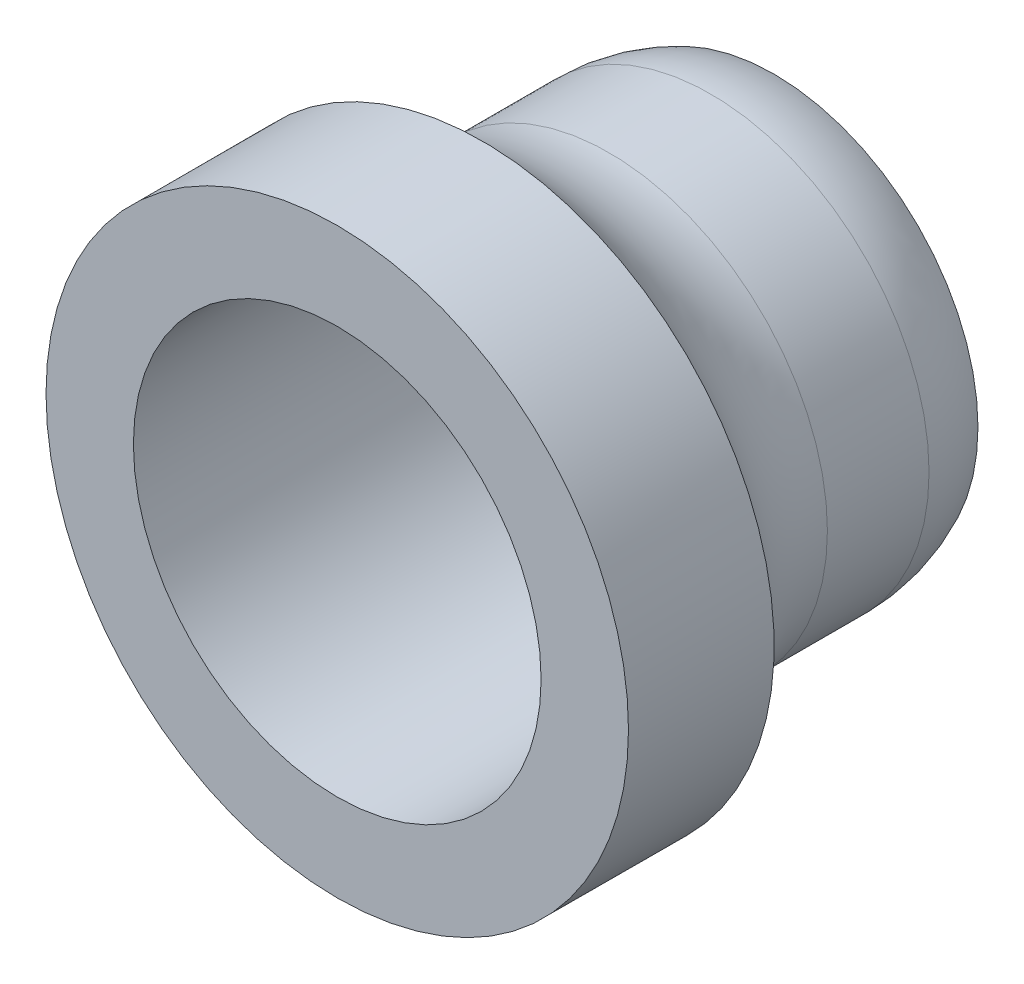
ISO-10303-21;
HEADER;
FILE_DESCRIPTION(('STEP AP214'),'2;1');
FILE_NAME('part.step','',(''),(''),'','','');
FILE_SCHEMA(('AUTOMOTIVE_DESIGN { 1 0 10303 214 1 1 1 1 }'));
ENDSEC;
DATA;
#1=APPLICATION_CONTEXT('core data for automotive mechanical design processes');
#2=APPLICATION_PROTOCOL_DEFINITION('international standard','automotive_design',2000,#1);
#3=PRODUCT_CONTEXT('',#1,'mechanical');
#4=PRODUCT('Part','Part','',(#3));
#5=PRODUCT_RELATED_PRODUCT_CATEGORY('part','',(#4));
#6=PRODUCT_DEFINITION_FORMATION('','',#4);
#7=PRODUCT_DEFINITION_CONTEXT('part definition',#1,'design');
#8=PRODUCT_DEFINITION('design','',#6,#7);
#9=PRODUCT_DEFINITION_SHAPE('','',#8);
#10=(LENGTH_UNIT() NAMED_UNIT(*) SI_UNIT(.MILLI.,.METRE.));
#11=(NAMED_UNIT(*) PLANE_ANGLE_UNIT() SI_UNIT($,.RADIAN.));
#12=(NAMED_UNIT(*) SI_UNIT($,.STERADIAN.) SOLID_ANGLE_UNIT());
#13=UNCERTAINTY_MEASURE_WITH_UNIT(LENGTH_MEASURE(1.E-05),#10,'distance_accuracy_value','');
#14=(GEOMETRIC_REPRESENTATION_CONTEXT(3) GLOBAL_UNCERTAINTY_ASSIGNED_CONTEXT((#13)) GLOBAL_UNIT_ASSIGNED_CONTEXT((#10,
#11,#12)) REPRESENTATION_CONTEXT('',''));
#15=CARTESIAN_POINT('',(0.,0.,0.));
#16=DIRECTION('',(0.,0.,1.));
#17=DIRECTION('',(1.,0.,0.));
#18=AXIS2_PLACEMENT_3D('',#15,#16,#17);
#19=CARTESIAN_POINT('',(0.,0.,30.));
#20=DIRECTION('',(0.,0.,-1.));
#21=DIRECTION('',(-1.,0.,0.));
#22=AXIS2_PLACEMENT_3D('',#19,#20,#21);
#23=CYLINDRICAL_SURFACE('',#22,20.);
#24=CARTESIAN_POINT('',(0.,0.,30.));
#25=DIRECTION('',(0.,0.,1.));
#26=DIRECTION('',(1.,0.,0.));
#27=AXIS2_PLACEMENT_3D('',#24,#25,#26);
#28=CIRCLE('',#27,20.);
#29=CARTESIAN_POINT('',(20.,0.,30.));
#30=VERTEX_POINT('',#29);
#31=EDGE_CURVE('E48',#30,#30,#28,.T.);
#32=ORIENTED_EDGE('',*,*,#31,.F.);
#33=EDGE_LOOP('',(#32));
#34=FACE_BOUND('',#33,.T.);
#35=CARTESIAN_POINT('',(0.,0.,20.));
#36=DIRECTION('',(0.,0.,-1.));
#37=DIRECTION('',(-1.,0.,0.));
#38=AXIS2_PLACEMENT_3D('',#35,#36,#37);
#39=CIRCLE('',#38,20.);
#40=CARTESIAN_POINT('',(-20.,0.,20.));
#41=VERTEX_POINT('',#40);
#42=EDGE_CURVE('E58',#41,#41,#39,.T.);
#43=ORIENTED_EDGE('',*,*,#42,.F.);
#44=EDGE_LOOP('',(#43));
#45=FACE_BOUND('',#44,.T.);
#46=ADVANCED_FACE('F37',(#34,#45),#23,.T.);
#47=CARTESIAN_POINT('',(0.,0.,30.));
#48=DIRECTION('',(0.,0.,1.));
#49=DIRECTION('',(1.,0.,0.));
#50=AXIS2_PLACEMENT_3D('',#47,#48,#49);
#51=PLANE('',#50);
#52=ORIENTED_EDGE('',*,*,#31,.T.);
#53=EDGE_LOOP('',(#52));
#54=FACE_BOUND('',#53,.T.);
#55=CARTESIAN_POINT('',(0.,0.,30.));
#56=DIRECTION('',(0.,0.,1.));
#57=DIRECTION('',(1.,0.,0.));
#58=AXIS2_PLACEMENT_3D('',#55,#56,#57);
#59=CIRCLE('',#58,14.);
#60=CARTESIAN_POINT('',(14.,0.,30.));
#61=VERTEX_POINT('',#60);
#62=EDGE_CURVE('E52',#61,#61,#59,.T.);
#63=ORIENTED_EDGE('',*,*,#62,.F.);
#64=EDGE_LOOP('',(#63));
#65=FACE_BOUND('',#64,.T.);
#66=ADVANCED_FACE('F67',(#54,#65),#51,.T.);
#67=CARTESIAN_POINT('',(0.,0.,30.));
#68=DIRECTION('',(0.,0.,-1.));
#69=DIRECTION('',(-1.,0.,0.));
#70=AXIS2_PLACEMENT_3D('',#67,#68,#69);
#71=CYLINDRICAL_SURFACE('',#70,14.);
#72=ORIENTED_EDGE('',*,*,#62,.T.);
#73=EDGE_LOOP('',(#72));
#74=FACE_BOUND('',#73,.T.);
#75=CARTESIAN_POINT('',(0.,0.,0.));
#76=DIRECTION('',(0.,0.,1.));
#77=DIRECTION('',(1.,0.,0.));
#78=AXIS2_PLACEMENT_3D('',#75,#76,#77);
#79=CIRCLE('',#78,14.);
#80=CARTESIAN_POINT('',(14.,0.,0.));
#81=VERTEX_POINT('',#80);
#82=EDGE_CURVE('E55',#81,#81,#79,.T.);
#83=ORIENTED_EDGE('',*,*,#82,.F.);
#84=EDGE_LOOP('',(#83));
#85=FACE_BOUND('',#84,.T.);
#86=ADVANCED_FACE('F75',(#74,#85),#71,.F.);
#87=CARTESIAN_POINT('',(0.,0.,20.));
#88=DIRECTION('',(0.,0.,-1.));
#89=DIRECTION('',(-1.,0.,0.));
#90=AXIS2_PLACEMENT_3D('',#87,#88,#89);
#91=CYLINDRICAL_SURFACE('',#90,15.);
#92=CARTESIAN_POINT('',(0.,0.,4.35889894354067));
#93=DIRECTION('',(0.,0.,-1.));
#94=DIRECTION('',(-1.,0.,0.));
#95=AXIS2_PLACEMENT_3D('',#92,#93,#94);
#96=CIRCLE('',#95,15.);
#97=CARTESIAN_POINT('',(-15.,0.,4.35889894354067));
#98=VERTEX_POINT('',#97);
#99=EDGE_CURVE('E10',#98,#98,#96,.F.);
#100=ORIENTED_EDGE('',*,*,#99,.T.);
#101=EDGE_LOOP('',(#100));
#102=FACE_BOUND('',#101,.T.);
#103=CARTESIAN_POINT('',(0.,0.,11.3397459621556));
#104=DIRECTION('',(0.,0.,1.));
#105=DIRECTION('',(1.,0.,0.));
#106=AXIS2_PLACEMENT_3D('',#103,#104,#105);
#107=CIRCLE('',#106,15.);
#108=CARTESIAN_POINT('',(15.,0.,11.3397459621556));
#109=VERTEX_POINT('',#108);
#110=EDGE_CURVE('E44',#109,#109,#107,.F.);
#111=ORIENTED_EDGE('',*,*,#110,.T.);
#112=EDGE_LOOP('',(#111));
#113=FACE_BOUND('',#112,.T.);
#114=ADVANCED_FACE('F82',(#102,#113),#91,.T.);
#115=CARTESIAN_POINT('',(0.,0.,4.35889894354067));
#116=DIRECTION('',(0.,0.,-1.));
#117=DIRECTION('',(-1.,0.,0.));
#118=AXIS2_PLACEMENT_3D('',#115,#116,#117);
#119=DEGENERATE_TOROIDAL_SURFACE('',#118,5.,10.,.T.);
#120=ORIENTED_EDGE('',*,*,#99,.F.);
#121=EDGE_LOOP('',(#120));
#122=FACE_BOUND('',#121,.T.);
#123=ORIENTED_EDGE('',*,*,#82,.T.);
#124=EDGE_LOOP('',(#123));
#125=FACE_BOUND('',#124,.T.);
#126=ADVANCED_FACE('F80',(#122,#125),#119,.T.);
#127=CARTESIAN_POINT('',(0.,0.,11.3397459621556));
#128=DIRECTION('',(0.,0.,1.));
#129=DIRECTION('',(1.,0.,0.));
#130=AXIS2_PLACEMENT_3D('',#127,#128,#129);
#131=TOROIDAL_SURFACE('',#130,25.,10.);
#132=ORIENTED_EDGE('',*,*,#42,.T.);
#133=EDGE_LOOP('',(#132));
#134=FACE_BOUND('',#133,.T.);
#135=ORIENTED_EDGE('',*,*,#110,.F.);
#136=EDGE_LOOP('',(#135));
#137=FACE_BOUND('',#136,.T.);
#138=ADVANCED_FACE('F39',(#134,#137),#131,.F.);
#139=CLOSED_SHELL('',(#46,#66,#86,#114,#126,#138));
#140=MANIFOLD_SOLID_BREP('B2',#139);
#141=ADVANCED_BREP_SHAPE_REPRESENTATION('',(#18,#140),#14);
#142=SHAPE_DEFINITION_REPRESENTATION(#9,#141);
ENDSEC;
END-ISO-10303-21;
